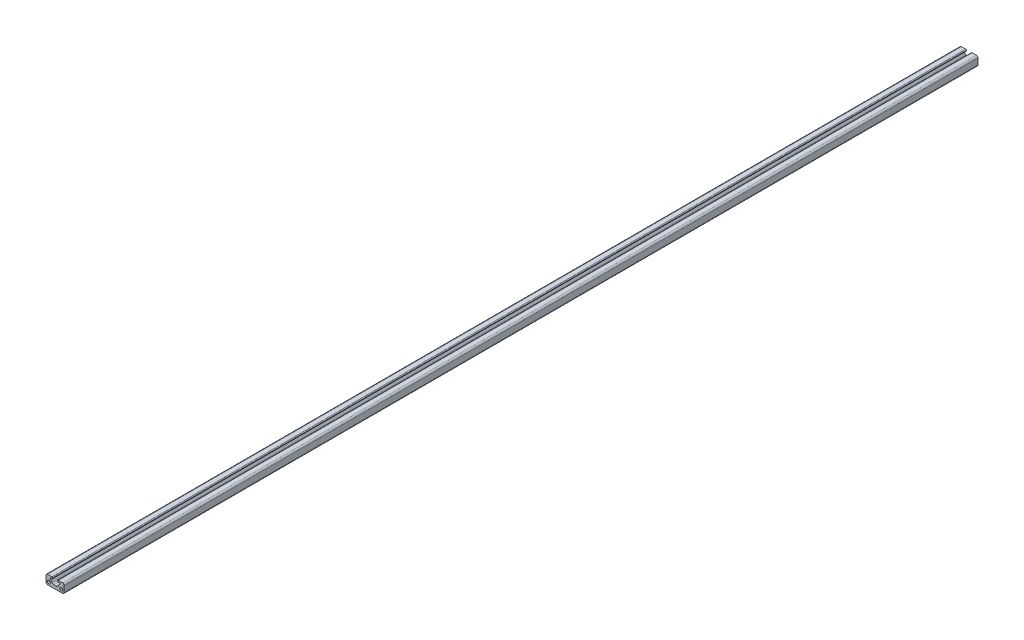
ISO-10303-21;
HEADER;
FILE_DESCRIPTION(('STEP AP214'),'2;1');
FILE_NAME('part.step','',(''),(''),'','','');
FILE_SCHEMA(('AUTOMOTIVE_DESIGN { 1 0 10303 214 1 1 1 1 }'));
ENDSEC;
DATA;
#1=APPLICATION_CONTEXT('core data for automotive mechanical design processes');
#2=APPLICATION_PROTOCOL_DEFINITION('international standard','automotive_design',2000,#1);
#3=PRODUCT_CONTEXT('',#1,'mechanical');
#4=PRODUCT('Part','Part','',(#3));
#5=PRODUCT_RELATED_PRODUCT_CATEGORY('part','',(#4));
#6=PRODUCT_DEFINITION_FORMATION('','',#4);
#7=PRODUCT_DEFINITION_CONTEXT('part definition',#1,'design');
#8=PRODUCT_DEFINITION('design','',#6,#7);
#9=PRODUCT_DEFINITION_SHAPE('','',#8);
#10=(LENGTH_UNIT() NAMED_UNIT(*) SI_UNIT(.MILLI.,.METRE.));
#11=(NAMED_UNIT(*) PLANE_ANGLE_UNIT() SI_UNIT($,.RADIAN.));
#12=(NAMED_UNIT(*) SI_UNIT($,.STERADIAN.) SOLID_ANGLE_UNIT());
#13=UNCERTAINTY_MEASURE_WITH_UNIT(LENGTH_MEASURE(1.E-05),#10,'distance_accuracy_value','');
#14=(GEOMETRIC_REPRESENTATION_CONTEXT(3) GLOBAL_UNCERTAINTY_ASSIGNED_CONTEXT((#13)) GLOBAL_UNIT_ASSIGNED_CONTEXT((#10,
#11,#12)) REPRESENTATION_CONTEXT('',''));
#15=CARTESIAN_POINT('',(0.,0.,0.));
#16=DIRECTION('',(0.,0.,1.));
#17=DIRECTION('',(1.,0.,0.));
#18=AXIS2_PLACEMENT_3D('',#15,#16,#17);
#19=CARTESIAN_POINT('',(0.,-1.87,1257.3));
#20=DIRECTION('',(0.,-1.,0.));
#21=DIRECTION('',(1.,0.,0.));
#22=AXIS2_PLACEMENT_3D('',#19,#20,#21);
#23=PLANE('',#22);
#24=DIRECTION('',(-1.,0.,0.));
#25=VECTOR('',#24,1.);
#26=CARTESIAN_POINT('',(0.,-1.87,1257.3));
#27=LINE('',#26,#25);
#28=CARTESIAN_POINT('',(1.68956591371128,-1.87,1257.3));
#29=VERTEX_POINT('',#28);
#30=CARTESIAN_POINT('',(-1.68956591371128,-1.87,1257.3));
#31=VERTEX_POINT('',#30);
#32=EDGE_CURVE('E334',#29,#31,#27,.T.);
#33=ORIENTED_EDGE('',*,*,#32,.F.);
#34=DIRECTION('',(0.,0.,-1.));
#35=VECTOR('',#34,1.);
#36=CARTESIAN_POINT('',(1.68956591371128,-1.87,4.44089209850063E-13));
#37=LINE('',#36,#35);
#38=CARTESIAN_POINT('',(1.68956591371128,-1.87,0.));
#39=VERTEX_POINT('',#38);
#40=EDGE_CURVE('E327',#29,#39,#37,.T.);
#41=ORIENTED_EDGE('',*,*,#40,.T.);
#42=DIRECTION('',(-1.,0.,0.));
#43=VECTOR('',#42,1.);
#44=CARTESIAN_POINT('',(0.,-1.87,0.));
#45=LINE('',#44,#43);
#46=CARTESIAN_POINT('',(-1.68956591371128,-1.87,0.));
#47=VERTEX_POINT('',#46);
#48=EDGE_CURVE('E333',#39,#47,#45,.T.);
#49=ORIENTED_EDGE('',*,*,#48,.T.);
#50=DIRECTION('',(0.,0.,-1.));
#51=VECTOR('',#50,1.);
#52=CARTESIAN_POINT('',(-1.68956591371128,-1.87,1257.3));
#53=LINE('',#52,#51);
#54=EDGE_CURVE('E319',#47,#31,#53,.F.);
#55=ORIENTED_EDGE('',*,*,#54,.T.);
#56=EDGE_LOOP('',(#33,#41,#49,#55));
#57=FACE_BOUND('',#56,.T.);
#58=ADVANCED_FACE('F36',(#57),#23,.F.);
#59=CARTESIAN_POINT('',(-3.05778914340892,-2.14411755860608,1257.3));
#60=DIRECTION('',(-0.818770593875491,-0.574120818821941,0.));
#61=DIRECTION('',(0.574120818821941,-0.818770593875491,0.));
#62=AXIS2_PLACEMENT_3D('',#59,#60,#61);
#63=PLANE('',#62);
#64=DIRECTION('',(-0.574120818821941,0.818770593875491,0.));
#65=VECTOR('',#64,1.);
#66=CARTESIAN_POINT('',(-3.05778914340892,-2.14411755860608,1257.3));
#67=LINE('',#66,#65);
#68=CARTESIAN_POINT('',(-4.14587769533775,-0.59236245646582,1257.3));
#69=VERTEX_POINT('',#68);
#70=CARTESIAN_POINT('',(-6.75724174982656,3.13178066397732,1257.3));
#71=VERTEX_POINT('',#70);
#72=EDGE_CURVE('E459',#69,#71,#67,.T.);
#73=ORIENTED_EDGE('',*,*,#72,.F.);
#74=DIRECTION('',(0.,0.,-1.));
#75=VECTOR('',#74,1.);
#76=CARTESIAN_POINT('',(-4.14587769533775,-0.59236245646582,4.44089209850063E-13));
#77=LINE('',#76,#75);
#78=CARTESIAN_POINT('',(-4.14587769533775,-0.59236245646582,0.));
#79=VERTEX_POINT('',#78);
#80=EDGE_CURVE('E316',#69,#79,#77,.T.);
#81=ORIENTED_EDGE('',*,*,#80,.T.);
#82=DIRECTION('',(-0.574120818821941,0.818770593875491,0.));
#83=VECTOR('',#82,1.);
#84=CARTESIAN_POINT('',(-3.05778914340892,-2.14411755860608,0.));
#85=LINE('',#84,#83);
#86=CARTESIAN_POINT('',(-6.75724174982656,3.13178066397732,0.));
#87=VERTEX_POINT('',#86);
#88=EDGE_CURVE('E339',#79,#87,#85,.T.);
#89=ORIENTED_EDGE('',*,*,#88,.T.);
#90=DIRECTION('',(0.,0.,-1.));
#91=VECTOR('',#90,1.);
#92=CARTESIAN_POINT('',(-6.75724174982656,3.13178066397732,1257.3));
#93=LINE('',#92,#91);
#94=EDGE_CURVE('E308',#87,#71,#93,.F.);
#95=ORIENTED_EDGE('',*,*,#94,.T.);
#96=EDGE_LOOP('',(#73,#81,#89,#95));
#97=FACE_BOUND('',#96,.T.);
#98=ADVANCED_FACE('F414',(#97),#63,.F.);
#99=CARTESIAN_POINT('',(0.,3.97,1257.3));
#100=DIRECTION('',(0.,-1.,0.));
#101=DIRECTION('',(1.,0.,0.));
#102=AXIS2_PLACEMENT_3D('',#99,#100,#101);
#103=PLANE('',#102);
#104=DIRECTION('',(-1.,0.,0.));
#105=VECTOR('',#104,1.);
#106=CARTESIAN_POINT('',(0.,3.97,1257.3));
#107=LINE('',#106,#105);
#108=CARTESIAN_POINT('',(-4.315,3.97,1257.3));
#109=VERTEX_POINT('',#108);
#110=CARTESIAN_POINT('',(-6.32124640858786,3.97,1257.3));
#111=VERTEX_POINT('',#110);
#112=EDGE_CURVE('E386',#109,#111,#107,.T.);
#113=ORIENTED_EDGE('',*,*,#112,.T.);
#114=DIRECTION('',(0.,0.,-1.));
#115=VECTOR('',#114,1.);
#116=CARTESIAN_POINT('',(-6.32124640858786,3.97,1257.3));
#117=LINE('',#116,#115);
#118=CARTESIAN_POINT('',(-6.32124640858786,3.97,0.));
#119=VERTEX_POINT('',#118);
#120=EDGE_CURVE('E305',#111,#119,#117,.T.);
#121=ORIENTED_EDGE('',*,*,#120,.T.);
#122=DIRECTION('',(-1.,0.,0.));
#123=VECTOR('',#122,1.);
#124=CARTESIAN_POINT('',(0.,3.97,0.));
#125=LINE('',#124,#123);
#126=CARTESIAN_POINT('',(-4.315,3.97,0.));
#127=VERTEX_POINT('',#126);
#128=EDGE_CURVE('E218',#127,#119,#125,.T.);
#129=ORIENTED_EDGE('',*,*,#128,.F.);
#130=DIRECTION('',(0.,0.,-1.));
#131=VECTOR('',#130,1.);
#132=CARTESIAN_POINT('',(-4.315,3.97,1257.3));
#133=LINE('',#132,#131);
#134=EDGE_CURVE('E237',#127,#109,#133,.F.);
#135=ORIENTED_EDGE('',*,*,#134,.T.);
#136=EDGE_LOOP('',(#113,#121,#129,#135));
#137=FACE_BOUND('',#136,.T.);
#138=ADVANCED_FACE('F419',(#137),#103,.T.);
#139=CARTESIAN_POINT('',(-3.25,0.,1257.3));
#140=DIRECTION('',(1.,0.,0.));
#141=DIRECTION('',(0.,1.,0.));
#142=AXIS2_PLACEMENT_3D('',#139,#140,#141);
#143=PLANE('',#142);
#144=DIRECTION('',(0.,-1.,0.));
#145=VECTOR('',#144,1.);
#146=CARTESIAN_POINT('',(-3.25,0.,1257.3));
#147=LINE('',#146,#145);
#148=CARTESIAN_POINT('',(-3.25,5.185,1257.3));
#149=VERTEX_POINT('',#148);
#150=CARTESIAN_POINT('',(-3.25,5.035,1257.3));
#151=VERTEX_POINT('',#150);
#152=EDGE_CURVE('E465',#149,#151,#147,.T.);
#153=ORIENTED_EDGE('',*,*,#152,.T.);
#154=DIRECTION('',(0.,0.,-1.));
#155=VECTOR('',#154,1.);
#156=CARTESIAN_POINT('',(-3.25,5.035,1257.3));
#157=LINE('',#156,#155);
#158=CARTESIAN_POINT('',(-3.25,5.035,0.));
#159=VERTEX_POINT('',#158);
#160=EDGE_CURVE('E217',#151,#159,#157,.T.);
#161=ORIENTED_EDGE('',*,*,#160,.T.);
#162=DIRECTION('',(0.,-1.,0.));
#163=VECTOR('',#162,1.);
#164=CARTESIAN_POINT('',(-3.25,0.,0.));
#165=LINE('',#164,#163);
#166=CARTESIAN_POINT('',(-3.25,5.185,0.));
#167=VERTEX_POINT('',#166);
#168=EDGE_CURVE('E200',#167,#159,#165,.T.);
#169=ORIENTED_EDGE('',*,*,#168,.F.);
#170=DIRECTION('',(0.,0.,-1.));
#171=VECTOR('',#170,1.);
#172=CARTESIAN_POINT('',(-3.25,5.185,1257.3));
#173=LINE('',#172,#171);
#174=EDGE_CURVE('E214',#167,#149,#173,.F.);
#175=ORIENTED_EDGE('',*,*,#174,.T.);
#176=EDGE_LOOP('',(#153,#161,#169,#175));
#177=FACE_BOUND('',#176,.T.);
#178=ADVANCED_FACE('F213',(#177),#143,.T.);
#179=CARTESIAN_POINT('',(0.,6.25,1257.3));
#180=DIRECTION('',(0.,-1.,0.));
#181=DIRECTION('',(1.,0.,0.));
#182=AXIS2_PLACEMENT_3D('',#179,#180,#181);
#183=PLANE('',#182);
#184=DIRECTION('',(-1.,0.,0.));
#185=VECTOR('',#184,1.);
#186=CARTESIAN_POINT('',(0.,6.25,0.));
#187=LINE('',#186,#185);
#188=CARTESIAN_POINT('',(-4.315,6.25,0.));
#189=VERTEX_POINT('',#188);
#190=CARTESIAN_POINT('',(-10.37,6.25,0.));
#191=VERTEX_POINT('',#190);
#192=EDGE_CURVE('E202',#189,#191,#187,.T.);
#193=ORIENTED_EDGE('',*,*,#192,.T.);
#194=DIRECTION('',(0.,0.,-1.));
#195=VECTOR('',#194,1.);
#196=CARTESIAN_POINT('',(-10.37,6.25,1257.3));
#197=LINE('',#196,#195);
#198=CARTESIAN_POINT('',(-10.37,6.25,1257.3));
#199=VERTEX_POINT('',#198);
#200=EDGE_CURVE('E294',#191,#199,#197,.F.);
#201=ORIENTED_EDGE('',*,*,#200,.T.);
#202=DIRECTION('',(-1.,0.,0.));
#203=VECTOR('',#202,1.);
#204=CARTESIAN_POINT('',(0.,6.25,1257.3));
#205=LINE('',#204,#203);
#206=CARTESIAN_POINT('',(-4.315,6.25,1257.3));
#207=VERTEX_POINT('',#206);
#208=EDGE_CURVE('E389',#207,#199,#205,.T.);
#209=ORIENTED_EDGE('',*,*,#208,.F.);
#210=DIRECTION('',(0.,0.,-1.));
#211=VECTOR('',#210,1.);
#212=CARTESIAN_POINT('',(-4.315,6.25,0.));
#213=LINE('',#212,#211);
#214=EDGE_CURVE('E247',#207,#189,#213,.T.);
#215=ORIENTED_EDGE('',*,*,#214,.T.);
#216=EDGE_LOOP('',(#193,#201,#209,#215));
#217=FACE_BOUND('',#216,.T.);
#218=ADVANCED_FACE('F425',(#217),#183,.F.);
#219=CARTESIAN_POINT('',(-12.5,0.,1257.3));
#220=DIRECTION('',(1.,0.,0.));
#221=DIRECTION('',(0.,1.,0.));
#222=AXIS2_PLACEMENT_3D('',#219,#220,#221);
#223=PLANE('',#222);
#224=DIRECTION('',(0.,-1.,0.));
#225=VECTOR('',#224,1.);
#226=CARTESIAN_POINT('',(-12.5,0.,0.));
#227=LINE('',#226,#225);
#228=CARTESIAN_POINT('',(-12.5,4.12,0.));
#229=VERTEX_POINT('',#228);
#230=CARTESIAN_POINT('',(-12.5,-4.12,0.));
#231=VERTEX_POINT('',#230);
#232=EDGE_CURVE('E352',#229,#231,#227,.T.);
#233=ORIENTED_EDGE('',*,*,#232,.T.);
#234=DIRECTION('',(0.,0.,-1.));
#235=VECTOR('',#234,1.);
#236=CARTESIAN_POINT('',(-12.5,-4.12,1257.3));
#237=LINE('',#236,#235);
#238=CARTESIAN_POINT('',(-12.5,-4.12,1257.3));
#239=VERTEX_POINT('',#238);
#240=EDGE_CURVE('E292',#231,#239,#237,.F.);
#241=ORIENTED_EDGE('',*,*,#240,.T.);
#242=DIRECTION('',(0.,-1.,0.));
#243=VECTOR('',#242,1.);
#244=CARTESIAN_POINT('',(-12.5,0.,1257.3));
#245=LINE('',#244,#243);
#246=CARTESIAN_POINT('',(-12.5,4.12,1257.3));
#247=VERTEX_POINT('',#246);
#248=EDGE_CURVE('E468',#247,#239,#245,.T.);
#249=ORIENTED_EDGE('',*,*,#248,.F.);
#250=DIRECTION('',(0.,0.,-1.));
#251=VECTOR('',#250,1.);
#252=CARTESIAN_POINT('',(-12.5,4.12,1257.3));
#253=LINE('',#252,#251);
#254=EDGE_CURVE('E289',#247,#229,#253,.T.);
#255=ORIENTED_EDGE('',*,*,#254,.T.);
#256=EDGE_LOOP('',(#233,#241,#249,#255));
#257=FACE_BOUND('',#256,.T.);
#258=ADVANCED_FACE('F426',(#257),#223,.F.);
#259=CARTESIAN_POINT('',(0.,-6.25,1257.3));
#260=DIRECTION('',(0.,-1.,0.));
#261=DIRECTION('',(1.,0.,0.));
#262=AXIS2_PLACEMENT_3D('',#259,#260,#261);
#263=PLANE('',#262);
#264=DIRECTION('',(-1.,0.,0.));
#265=VECTOR('',#264,1.);
#266=CARTESIAN_POINT('',(0.,-6.25,0.));
#267=LINE('',#266,#265);
#268=CARTESIAN_POINT('',(10.37,-6.25,0.));
#269=VERTEX_POINT('',#268);
#270=CARTESIAN_POINT('',(-10.37,-6.25,0.));
#271=VERTEX_POINT('',#270);
#272=EDGE_CURVE('E356',#269,#271,#267,.T.);
#273=ORIENTED_EDGE('',*,*,#272,.F.);
#274=DIRECTION('',(0.,0.,-1.));
#275=VECTOR('',#274,1.);
#276=CARTESIAN_POINT('',(10.37,-6.25,1257.3));
#277=LINE('',#276,#275);
#278=CARTESIAN_POINT('',(10.37,-6.25,1257.3));
#279=VERTEX_POINT('',#278);
#280=EDGE_CURVE('E281',#269,#279,#277,.F.);
#281=ORIENTED_EDGE('',*,*,#280,.T.);
#282=DIRECTION('',(-1.,0.,0.));
#283=VECTOR('',#282,1.);
#284=CARTESIAN_POINT('',(0.,-6.25,1257.3));
#285=LINE('',#284,#283);
#286=CARTESIAN_POINT('',(-10.37,-6.25,1257.3));
#287=VERTEX_POINT('',#286);
#288=EDGE_CURVE('E470',#279,#287,#285,.T.);
#289=ORIENTED_EDGE('',*,*,#288,.T.);
#290=DIRECTION('',(0.,0.,-1.));
#291=VECTOR('',#290,1.);
#292=CARTESIAN_POINT('',(-10.37,-6.25,0.));
#293=LINE('',#292,#291);
#294=EDGE_CURVE('E278',#287,#271,#293,.T.);
#295=ORIENTED_EDGE('',*,*,#294,.T.);
#296=EDGE_LOOP('',(#273,#281,#289,#295));
#297=FACE_BOUND('',#296,.T.);
#298=ADVANCED_FACE('F429',(#297),#263,.T.);
#299=CARTESIAN_POINT('',(12.5,0.,1257.3));
#300=DIRECTION('',(1.,0.,0.));
#301=DIRECTION('',(0.,1.,0.));
#302=AXIS2_PLACEMENT_3D('',#299,#300,#301);
#303=PLANE('',#302);
#304=DIRECTION('',(0.,-1.,0.));
#305=VECTOR('',#304,1.);
#306=CARTESIAN_POINT('',(12.5,0.,1257.3));
#307=LINE('',#306,#305);
#308=CARTESIAN_POINT('',(12.5,4.12,1257.3));
#309=VERTEX_POINT('',#308);
#310=CARTESIAN_POINT('',(12.5,-4.12,1257.3));
#311=VERTEX_POINT('',#310);
#312=EDGE_CURVE('E387',#309,#311,#307,.T.);
#313=ORIENTED_EDGE('',*,*,#312,.T.);
#314=DIRECTION('',(0.,0.,-1.));
#315=VECTOR('',#314,1.);
#316=CARTESIAN_POINT('',(12.5,-4.12,1257.3));
#317=LINE('',#316,#315);
#318=CARTESIAN_POINT('',(12.5,-4.12,0.));
#319=VERTEX_POINT('',#318);
#320=EDGE_CURVE('E269',#311,#319,#317,.T.);
#321=ORIENTED_EDGE('',*,*,#320,.T.);
#322=DIRECTION('',(0.,-1.,0.));
#323=VECTOR('',#322,1.);
#324=CARTESIAN_POINT('',(12.5,0.,0.));
#325=LINE('',#324,#323);
#326=CARTESIAN_POINT('',(12.5,4.12,0.));
#327=VERTEX_POINT('',#326);
#328=EDGE_CURVE('E359',#327,#319,#325,.T.);
#329=ORIENTED_EDGE('',*,*,#328,.F.);
#330=DIRECTION('',(0.,0.,-1.));
#331=VECTOR('',#330,1.);
#332=CARTESIAN_POINT('',(12.5,4.12,1257.3));
#333=LINE('',#332,#331);
#334=EDGE_CURVE('E265',#327,#309,#333,.F.);
#335=ORIENTED_EDGE('',*,*,#334,.T.);
#336=EDGE_LOOP('',(#313,#321,#329,#335));
#337=FACE_BOUND('',#336,.T.);
#338=ADVANCED_FACE('F433',(#337),#303,.T.);
#339=CARTESIAN_POINT('',(10.37,6.25,1257.3));
#340=VERTEX_POINT('',#339);
#341=CARTESIAN_POINT('',(4.315,6.25,1257.3));
#342=VERTEX_POINT('',#341);
#343=EDGE_CURVE('E382',#340,#342,#205,.T.);
#344=ORIENTED_EDGE('',*,*,#343,.F.);
#345=DIRECTION('',(0.,0.,-1.));
#346=VECTOR('',#345,1.);
#347=CARTESIAN_POINT('',(10.37,6.25,0.));
#348=LINE('',#347,#346);
#349=CARTESIAN_POINT('',(10.37,6.25,0.));
#350=VERTEX_POINT('',#349);
#351=EDGE_CURVE('E260',#340,#350,#348,.T.);
#352=ORIENTED_EDGE('',*,*,#351,.T.);
#353=CARTESIAN_POINT('',(4.315,6.25,0.));
#354=VERTEX_POINT('',#353);
#355=EDGE_CURVE('E353',#350,#354,#187,.T.);
#356=ORIENTED_EDGE('',*,*,#355,.T.);
#357=DIRECTION('',(0.,0.,-1.));
#358=VECTOR('',#357,1.);
#359=CARTESIAN_POINT('',(4.315,6.25,1257.3));
#360=LINE('',#359,#358);
#361=EDGE_CURVE('E257',#354,#342,#360,.F.);
#362=ORIENTED_EDGE('',*,*,#361,.T.);
#363=EDGE_LOOP('',(#344,#352,#356,#362));
#364=FACE_BOUND('',#363,.T.);
#365=ADVANCED_FACE('F368',(#364),#183,.F.);
#366=CARTESIAN_POINT('',(3.25,0.,1257.3));
#367=DIRECTION('',(1.,0.,0.));
#368=DIRECTION('',(0.,1.,0.));
#369=AXIS2_PLACEMENT_3D('',#366,#367,#368);
#370=PLANE('',#369);
#371=DIRECTION('',(0.,-1.,0.));
#372=VECTOR('',#371,1.);
#373=CARTESIAN_POINT('',(3.25,0.,0.));
#374=LINE('',#373,#372);
#375=CARTESIAN_POINT('',(3.25,5.185,0.));
#376=VERTEX_POINT('',#375);
#377=CARTESIAN_POINT('',(3.25,5.035,0.));
#378=VERTEX_POINT('',#377);
#379=EDGE_CURVE('E360',#376,#378,#374,.T.);
#380=ORIENTED_EDGE('',*,*,#379,.T.);
#381=DIRECTION('',(0.,0.,-1.));
#382=VECTOR('',#381,1.);
#383=CARTESIAN_POINT('',(3.25,5.035,1257.3));
#384=LINE('',#383,#382);
#385=CARTESIAN_POINT('',(3.25,5.035,1257.3));
#386=VERTEX_POINT('',#385);
#387=EDGE_CURVE('E255',#378,#386,#384,.F.);
#388=ORIENTED_EDGE('',*,*,#387,.T.);
#389=DIRECTION('',(0.,-1.,0.));
#390=VECTOR('',#389,1.);
#391=CARTESIAN_POINT('',(3.25,0.,1257.3));
#392=LINE('',#391,#390);
#393=CARTESIAN_POINT('',(3.25,5.185,1257.3));
#394=VERTEX_POINT('',#393);
#395=EDGE_CURVE('E380',#394,#386,#392,.T.);
#396=ORIENTED_EDGE('',*,*,#395,.F.);
#397=DIRECTION('',(0.,0.,-1.));
#398=VECTOR('',#397,1.);
#399=CARTESIAN_POINT('',(3.25,5.185,1257.3));
#400=LINE('',#399,#398);
#401=EDGE_CURVE('E252',#394,#376,#400,.T.);
#402=ORIENTED_EDGE('',*,*,#401,.T.);
#403=EDGE_LOOP('',(#380,#388,#396,#402));
#404=FACE_BOUND('',#403,.T.);
#405=ADVANCED_FACE('F383',(#404),#370,.F.);
#406=CARTESIAN_POINT('',(6.32124640858786,3.97,0.));
#407=VERTEX_POINT('',#406);
#408=CARTESIAN_POINT('',(4.315,3.97,0.));
#409=VERTEX_POINT('',#408);
#410=EDGE_CURVE('E349',#407,#409,#125,.T.);
#411=ORIENTED_EDGE('',*,*,#410,.F.);
#412=DIRECTION('',(0.,0.,-1.));
#413=VECTOR('',#412,1.);
#414=CARTESIAN_POINT('',(6.32124640858786,3.97,1257.3));
#415=LINE('',#414,#413);
#416=CARTESIAN_POINT('',(6.32124640858786,3.97,1257.3));
#417=VERTEX_POINT('',#416);
#418=EDGE_CURVE('E299',#407,#417,#415,.F.);
#419=ORIENTED_EDGE('',*,*,#418,.T.);
#420=CARTESIAN_POINT('',(4.315,3.97,1257.3));
#421=VERTEX_POINT('',#420);
#422=EDGE_CURVE('E227',#417,#421,#107,.T.);
#423=ORIENTED_EDGE('',*,*,#422,.T.);
#424=DIRECTION('',(0.,0.,-1.));
#425=VECTOR('',#424,1.);
#426=CARTESIAN_POINT('',(4.315,3.97,0.));
#427=LINE('',#426,#425);
#428=EDGE_CURVE('E249',#421,#409,#427,.T.);
#429=ORIENTED_EDGE('',*,*,#428,.T.);
#430=EDGE_LOOP('',(#411,#419,#423,#429));
#431=FACE_BOUND('',#430,.T.);
#432=ADVANCED_FACE('F408',(#431),#103,.T.);
#433=CARTESIAN_POINT('',(-8.5,-2.25,1257.3));
#434=DIRECTION('',(0.,0.,-1.));
#435=DIRECTION('',(-1.,0.,0.));
#436=AXIS2_PLACEMENT_3D('',#433,#434,#435);
#437=CYLINDRICAL_SURFACE('',#436,2.);
#438=CARTESIAN_POINT('',(-8.5,-2.25,1257.3));
#439=DIRECTION('',(0.,0.,1.));
#440=DIRECTION('',(1.,0.,0.));
#441=AXIS2_PLACEMENT_3D('',#438,#439,#440);
#442=CIRCLE('',#441,2.);
#443=CARTESIAN_POINT('',(-6.5,-2.25,1257.3));
#444=VERTEX_POINT('',#443);
#445=EDGE_CURVE('E457',#444,#444,#442,.T.);
#446=ORIENTED_EDGE('',*,*,#445,.T.);
#447=EDGE_LOOP('',(#446));
#448=FACE_BOUND('',#447,.T.);
#449=CARTESIAN_POINT('',(-8.5,-2.25,0.));
#450=DIRECTION('',(0.,0.,1.));
#451=DIRECTION('',(1.,0.,0.));
#452=AXIS2_PLACEMENT_3D('',#449,#450,#451);
#453=CIRCLE('',#452,2.);
#454=CARTESIAN_POINT('',(-6.5,-2.25,0.));
#455=VERTEX_POINT('',#454);
#456=EDGE_CURVE('E340',#455,#455,#453,.T.);
#457=ORIENTED_EDGE('',*,*,#456,.F.);
#458=EDGE_LOOP('',(#457));
#459=FACE_BOUND('',#458,.T.);
#460=ADVANCED_FACE('F400',(#448,#459),#437,.F.);
#461=CARTESIAN_POINT('',(8.5,-2.25,1257.3));
#462=DIRECTION('',(0.,0.,-1.));
#463=DIRECTION('',(-1.,0.,0.));
#464=AXIS2_PLACEMENT_3D('',#461,#462,#463);
#465=CYLINDRICAL_SURFACE('',#464,2.);
#466=CARTESIAN_POINT('',(8.5,-2.25,1257.3));
#467=DIRECTION('',(0.,0.,1.));
#468=DIRECTION('',(1.,0.,0.));
#469=AXIS2_PLACEMENT_3D('',#466,#467,#468);
#470=CIRCLE('',#469,2.);
#471=CARTESIAN_POINT('',(10.5,-2.25,1257.3));
#472=VERTEX_POINT('',#471);
#473=EDGE_CURVE('E454',#472,#472,#470,.T.);
#474=ORIENTED_EDGE('',*,*,#473,.T.);
#475=EDGE_LOOP('',(#474));
#476=FACE_BOUND('',#475,.T.);
#477=CARTESIAN_POINT('',(8.5,-2.25,0.));
#478=DIRECTION('',(0.,0.,1.));
#479=DIRECTION('',(1.,0.,0.));
#480=AXIS2_PLACEMENT_3D('',#477,#478,#479);
#481=CIRCLE('',#480,2.);
#482=CARTESIAN_POINT('',(10.5,-2.25,0.));
#483=VERTEX_POINT('',#482);
#484=EDGE_CURVE('E344',#483,#483,#481,.T.);
#485=ORIENTED_EDGE('',*,*,#484,.F.);
#486=EDGE_LOOP('',(#485));
#487=FACE_BOUND('',#486,.T.);
#488=ADVANCED_FACE('F397',(#476,#487),#465,.F.);
#489=CARTESIAN_POINT('',(3.05778914340892,-2.14411755860608,1257.3));
#490=DIRECTION('',(0.818770593875491,-0.574120818821941,0.));
#491=DIRECTION('',(0.574120818821941,0.818770593875491,0.));
#492=AXIS2_PLACEMENT_3D('',#489,#490,#491);
#493=PLANE('',#492);
#494=DIRECTION('',(-0.574120818821941,-0.818770593875491,0.));
#495=VECTOR('',#494,1.);
#496=CARTESIAN_POINT('',(3.05778914340892,-2.14411755860608,0.));
#497=LINE('',#496,#495);
#498=CARTESIAN_POINT('',(6.75724174982656,3.13178066397732,0.));
#499=VERTEX_POINT('',#498);
#500=CARTESIAN_POINT('',(4.14587769533775,-0.592362456465818,0.));
#501=VERTEX_POINT('',#500);
#502=EDGE_CURVE('E230',#499,#501,#497,.T.);
#503=ORIENTED_EDGE('',*,*,#502,.T.);
#504=DIRECTION('',(0.,0.,-1.));
#505=VECTOR('',#504,1.);
#506=CARTESIAN_POINT('',(4.14587769533775,-0.592362456465819,1257.3));
#507=LINE('',#506,#505);
#508=CARTESIAN_POINT('',(4.14587769533775,-0.592362456465818,1257.3));
#509=VERTEX_POINT('',#508);
#510=EDGE_CURVE('E57',#501,#509,#507,.F.);
#511=ORIENTED_EDGE('',*,*,#510,.T.);
#512=DIRECTION('',(-0.574120818821941,-0.818770593875491,0.));
#513=VECTOR('',#512,1.);
#514=CARTESIAN_POINT('',(3.05778914340892,-2.14411755860608,1257.3));
#515=LINE('',#514,#513);
#516=CARTESIAN_POINT('',(6.75724174982656,3.13178066397732,1257.3));
#517=VERTEX_POINT('',#516);
#518=EDGE_CURVE('E223',#517,#509,#515,.T.);
#519=ORIENTED_EDGE('',*,*,#518,.F.);
#520=DIRECTION('',(0.,0.,-1.));
#521=VECTOR('',#520,1.);
#522=CARTESIAN_POINT('',(6.75724174982656,3.13178066397732,1257.3));
#523=LINE('',#522,#521);
#524=EDGE_CURVE('E296',#517,#499,#523,.T.);
#525=ORIENTED_EDGE('',*,*,#524,.T.);
#526=EDGE_LOOP('',(#503,#511,#519,#525));
#527=FACE_BOUND('',#526,.T.);
#528=ADVANCED_FACE('F399',(#527),#493,.F.);
#529=CARTESIAN_POINT('',(0.,0.,1257.3));
#530=DIRECTION('',(0.,0.,1.));
#531=DIRECTION('',(1.,0.,0.));
#532=AXIS2_PLACEMENT_3D('',#529,#530,#531);
#533=PLANE('',#532);
#534=ORIENTED_EDGE('',*,*,#473,.F.);
#535=EDGE_LOOP('',(#534));
#536=FACE_BOUND('',#535,.T.);
#537=ORIENTED_EDGE('',*,*,#445,.F.);
#538=EDGE_LOOP('',(#537));
#539=FACE_BOUND('',#538,.T.);
#540=ORIENTED_EDGE('',*,*,#288,.F.);
#541=CARTESIAN_POINT('',(10.37,-4.12,1257.3));
#542=DIRECTION('',(0.,0.,1.));
#543=DIRECTION('',(1.,0.,0.));
#544=AXIS2_PLACEMENT_3D('',#541,#542,#543);
#545=CIRCLE('',#544,2.13);
#546=EDGE_CURVE('E287',#279,#311,#545,.T.);
#547=ORIENTED_EDGE('',*,*,#546,.T.);
#548=ORIENTED_EDGE('',*,*,#312,.F.);
#549=CARTESIAN_POINT('',(10.37,4.12,1257.3));
#550=DIRECTION('',(0.,0.,1.));
#551=DIRECTION('',(1.,0.,0.));
#552=AXIS2_PLACEMENT_3D('',#549,#550,#551);
#553=CIRCLE('',#552,2.13);
#554=EDGE_CURVE('E267',#309,#340,#553,.T.);
#555=ORIENTED_EDGE('',*,*,#554,.T.);
#556=ORIENTED_EDGE('',*,*,#343,.T.);
#557=CARTESIAN_POINT('',(4.315,5.185,1257.3));
#558=DIRECTION('',(0.,0.,1.));
#559=DIRECTION('',(1.,0.,0.));
#560=AXIS2_PLACEMENT_3D('',#557,#558,#559);
#561=CIRCLE('',#560,1.065);
#562=EDGE_CURVE('E239',#342,#394,#561,.T.);
#563=ORIENTED_EDGE('',*,*,#562,.T.);
#564=ORIENTED_EDGE('',*,*,#395,.T.);
#565=CARTESIAN_POINT('',(4.315,5.035,1257.3));
#566=DIRECTION('',(0.,0.,1.));
#567=DIRECTION('',(1.,0.,0.));
#568=AXIS2_PLACEMENT_3D('',#565,#566,#567);
#569=CIRCLE('',#568,1.065);
#570=EDGE_CURVE('E241',#386,#421,#569,.T.);
#571=ORIENTED_EDGE('',*,*,#570,.T.);
#572=ORIENTED_EDGE('',*,*,#422,.F.);
#573=CARTESIAN_POINT('',(6.32124640858786,3.4375,1257.3));
#574=DIRECTION('',(0.,0.,1.));
#575=DIRECTION('',(1.,0.,0.));
#576=AXIS2_PLACEMENT_3D('',#573,#574,#575);
#577=CIRCLE('',#576,0.5325);
#578=EDGE_CURVE('E303',#417,#517,#577,.F.);
#579=ORIENTED_EDGE('',*,*,#578,.T.);
#580=ORIENTED_EDGE('',*,*,#518,.T.);
#581=CARTESIAN_POINT('',(1.68956591371127,1.13,1257.3));
#582=DIRECTION('',(0.,0.,1.));
#583=DIRECTION('',(1.,0.,0.));
#584=AXIS2_PLACEMENT_3D('',#581,#582,#583);
#585=CIRCLE('',#584,3.);
#586=EDGE_CURVE('E11',#509,#29,#585,.F.);
#587=ORIENTED_EDGE('',*,*,#586,.T.);
#588=ORIENTED_EDGE('',*,*,#32,.T.);
#589=CARTESIAN_POINT('',(-1.68956591371128,1.13,1257.3));
#590=DIRECTION('',(0.,0.,1.));
#591=DIRECTION('',(1.,0.,0.));
#592=AXIS2_PLACEMENT_3D('',#589,#590,#591);
#593=CIRCLE('',#592,3.);
#594=EDGE_CURVE('E325',#31,#69,#593,.F.);
#595=ORIENTED_EDGE('',*,*,#594,.T.);
#596=ORIENTED_EDGE('',*,*,#72,.T.);
#597=CARTESIAN_POINT('',(-6.32124640858786,3.4375,1257.3));
#598=DIRECTION('',(0.,0.,1.));
#599=DIRECTION('',(1.,0.,0.));
#600=AXIS2_PLACEMENT_3D('',#597,#598,#599);
#601=CIRCLE('',#600,0.5325);
#602=EDGE_CURVE('E314',#71,#111,#601,.F.);
#603=ORIENTED_EDGE('',*,*,#602,.T.);
#604=ORIENTED_EDGE('',*,*,#112,.F.);
#605=CARTESIAN_POINT('',(-4.315,5.035,1257.3));
#606=DIRECTION('',(0.,0.,1.));
#607=DIRECTION('',(1.,0.,0.));
#608=AXIS2_PLACEMENT_3D('',#605,#606,#607);
#609=CIRCLE('',#608,1.065);
#610=EDGE_CURVE('E245',#109,#151,#609,.T.);
#611=ORIENTED_EDGE('',*,*,#610,.T.);
#612=ORIENTED_EDGE('',*,*,#152,.F.);
#613=CARTESIAN_POINT('',(-4.315,5.185,1257.3));
#614=DIRECTION('',(0.,0.,1.));
#615=DIRECTION('',(1.,0.,0.));
#616=AXIS2_PLACEMENT_3D('',#613,#614,#615);
#617=CIRCLE('',#616,1.065);
#618=EDGE_CURVE('E222',#149,#207,#617,.T.);
#619=ORIENTED_EDGE('',*,*,#618,.T.);
#620=ORIENTED_EDGE('',*,*,#208,.T.);
#621=CARTESIAN_POINT('',(-10.37,4.12,1257.3));
#622=DIRECTION('',(0.,0.,1.));
#623=DIRECTION('',(1.,0.,0.));
#624=AXIS2_PLACEMENT_3D('',#621,#622,#623);
#625=CIRCLE('',#624,2.13);
#626=EDGE_CURVE('E283',#199,#247,#625,.T.);
#627=ORIENTED_EDGE('',*,*,#626,.T.);
#628=ORIENTED_EDGE('',*,*,#248,.T.);
#629=CARTESIAN_POINT('',(-10.37,-4.12,1257.3));
#630=DIRECTION('',(0.,0.,1.));
#631=DIRECTION('',(1.,0.,0.));
#632=AXIS2_PLACEMENT_3D('',#629,#630,#631);
#633=CIRCLE('',#632,2.13);
#634=EDGE_CURVE('E285',#239,#287,#633,.T.);
#635=ORIENTED_EDGE('',*,*,#634,.T.);
#636=EDGE_LOOP('',(#540,#547,#548,#555,#556,#563,#564,#571,#572,#579,#580,#587,#588,#595,#596,
#603,#604,#611,#612,#619,#620,#627,#628,#635));
#637=FACE_BOUND('',#636,.T.);
#638=ADVANCED_FACE('F379',(#536,#539,#637),#533,.T.);
#639=CARTESIAN_POINT('',(0.,0.,0.));
#640=DIRECTION('',(0.,0.,1.));
#641=DIRECTION('',(1.,0.,0.));
#642=AXIS2_PLACEMENT_3D('',#639,#640,#641);
#643=PLANE('',#642);
#644=ORIENTED_EDGE('',*,*,#484,.T.);
#645=EDGE_LOOP('',(#644));
#646=FACE_BOUND('',#645,.T.);
#647=ORIENTED_EDGE('',*,*,#456,.T.);
#648=EDGE_LOOP('',(#647));
#649=FACE_BOUND('',#648,.T.);
#650=ORIENTED_EDGE('',*,*,#328,.T.);
#651=CARTESIAN_POINT('',(10.37,-4.12,0.));
#652=DIRECTION('',(0.,0.,1.));
#653=DIRECTION('',(1.,0.,0.));
#654=AXIS2_PLACEMENT_3D('',#651,#652,#653);
#655=CIRCLE('',#654,2.13);
#656=EDGE_CURVE('E276',#319,#269,#655,.F.);
#657=ORIENTED_EDGE('',*,*,#656,.T.);
#658=ORIENTED_EDGE('',*,*,#272,.T.);
#659=CARTESIAN_POINT('',(-10.37,-4.12,0.));
#660=DIRECTION('',(0.,0.,1.));
#661=DIRECTION('',(1.,0.,0.));
#662=AXIS2_PLACEMENT_3D('',#659,#660,#661);
#663=CIRCLE('',#662,2.13);
#664=EDGE_CURVE('E274',#271,#231,#663,.F.);
#665=ORIENTED_EDGE('',*,*,#664,.T.);
#666=ORIENTED_EDGE('',*,*,#232,.F.);
#667=CARTESIAN_POINT('',(-10.37,4.12,0.));
#668=DIRECTION('',(0.,0.,1.));
#669=DIRECTION('',(1.,0.,0.));
#670=AXIS2_PLACEMENT_3D('',#667,#668,#669);
#671=CIRCLE('',#670,2.13);
#672=EDGE_CURVE('E272',#229,#191,#671,.F.);
#673=ORIENTED_EDGE('',*,*,#672,.T.);
#674=ORIENTED_EDGE('',*,*,#192,.F.);
#675=CARTESIAN_POINT('',(-4.315,5.185,0.));
#676=DIRECTION('',(0.,0.,1.));
#677=DIRECTION('',(1.,0.,0.));
#678=AXIS2_PLACEMENT_3D('',#675,#676,#677);
#679=CIRCLE('',#678,1.065);
#680=EDGE_CURVE('E196',#189,#167,#679,.F.);
#681=ORIENTED_EDGE('',*,*,#680,.T.);
#682=ORIENTED_EDGE('',*,*,#168,.T.);
#683=CARTESIAN_POINT('',(-4.315,5.035,0.));
#684=DIRECTION('',(0.,0.,1.));
#685=DIRECTION('',(1.,0.,0.));
#686=AXIS2_PLACEMENT_3D('',#683,#684,#685);
#687=CIRCLE('',#686,1.065);
#688=EDGE_CURVE('E207',#159,#127,#687,.F.);
#689=ORIENTED_EDGE('',*,*,#688,.T.);
#690=ORIENTED_EDGE('',*,*,#128,.T.);
#691=CARTESIAN_POINT('',(-6.32124640858786,3.4375,0.));
#692=DIRECTION('',(0.,0.,1.));
#693=DIRECTION('',(1.,0.,0.));
#694=AXIS2_PLACEMENT_3D('',#691,#692,#693);
#695=CIRCLE('',#694,0.5325);
#696=EDGE_CURVE('E311',#119,#87,#695,.T.);
#697=ORIENTED_EDGE('',*,*,#696,.T.);
#698=ORIENTED_EDGE('',*,*,#88,.F.);
#699=CARTESIAN_POINT('',(-1.68956591371128,1.13,0.));
#700=DIRECTION('',(0.,0.,1.));
#701=DIRECTION('',(1.,0.,0.));
#702=AXIS2_PLACEMENT_3D('',#699,#700,#701);
#703=CIRCLE('',#702,3.);
#704=EDGE_CURVE('E322',#79,#47,#703,.T.);
#705=ORIENTED_EDGE('',*,*,#704,.T.);
#706=ORIENTED_EDGE('',*,*,#48,.F.);
#707=CARTESIAN_POINT('',(1.68956591371127,1.13,0.));
#708=DIRECTION('',(0.,0.,1.));
#709=DIRECTION('',(1.,0.,0.));
#710=AXIS2_PLACEMENT_3D('',#707,#708,#709);
#711=CIRCLE('',#710,3.);
#712=EDGE_CURVE('E44',#39,#501,#711,.T.);
#713=ORIENTED_EDGE('',*,*,#712,.T.);
#714=ORIENTED_EDGE('',*,*,#502,.F.);
#715=CARTESIAN_POINT('',(6.32124640858786,3.4375,0.));
#716=DIRECTION('',(0.,0.,1.));
#717=DIRECTION('',(1.,0.,0.));
#718=AXIS2_PLACEMENT_3D('',#715,#716,#717);
#719=CIRCLE('',#718,0.5325);
#720=EDGE_CURVE('E301',#499,#407,#719,.T.);
#721=ORIENTED_EDGE('',*,*,#720,.T.);
#722=ORIENTED_EDGE('',*,*,#410,.T.);
#723=CARTESIAN_POINT('',(4.315,5.035,0.));
#724=DIRECTION('',(0.,0.,1.));
#725=DIRECTION('',(1.,0.,0.));
#726=AXIS2_PLACEMENT_3D('',#723,#724,#725);
#727=CIRCLE('',#726,1.065);
#728=EDGE_CURVE('E208',#409,#378,#727,.F.);
#729=ORIENTED_EDGE('',*,*,#728,.T.);
#730=ORIENTED_EDGE('',*,*,#379,.F.);
#731=CARTESIAN_POINT('',(4.315,5.185,0.));
#732=DIRECTION('',(0.,0.,1.));
#733=DIRECTION('',(1.,0.,0.));
#734=AXIS2_PLACEMENT_3D('',#731,#732,#733);
#735=CIRCLE('',#734,1.065);
#736=EDGE_CURVE('E225',#376,#354,#735,.F.);
#737=ORIENTED_EDGE('',*,*,#736,.T.);
#738=ORIENTED_EDGE('',*,*,#355,.F.);
#739=CARTESIAN_POINT('',(10.37,4.12,0.));
#740=DIRECTION('',(0.,0.,1.));
#741=DIRECTION('',(1.,0.,0.));
#742=AXIS2_PLACEMENT_3D('',#739,#740,#741);
#743=CIRCLE('',#742,2.13);
#744=EDGE_CURVE('E263',#350,#327,#743,.F.);
#745=ORIENTED_EDGE('',*,*,#744,.T.);
#746=EDGE_LOOP('',(#650,#657,#658,#665,#666,#673,#674,#681,#682,#689,#690,#697,#698,#705,#706,
#713,#714,#721,#722,#729,#730,#737,#738,#745));
#747=FACE_BOUND('',#746,.T.);
#748=ADVANCED_FACE('F199',(#646,#649,#747),#643,.F.);
#749=CARTESIAN_POINT('',(-4.315,5.035,1257.3));
#750=DIRECTION('',(0.,0.,-1.));
#751=DIRECTION('',(-1.,0.,0.));
#752=AXIS2_PLACEMENT_3D('',#749,#750,#751);
#753=CYLINDRICAL_SURFACE('',#752,1.065);
#754=ORIENTED_EDGE('',*,*,#610,.F.);
#755=ORIENTED_EDGE('',*,*,#134,.F.);
#756=ORIENTED_EDGE('',*,*,#688,.F.);
#757=ORIENTED_EDGE('',*,*,#160,.F.);
#758=EDGE_LOOP('',(#754,#755,#756,#757));
#759=FACE_BOUND('',#758,.T.);
#760=ADVANCED_FACE('F447',(#759),#753,.T.);
#761=CARTESIAN_POINT('',(-4.315,5.185,1257.3));
#762=DIRECTION('',(0.,0.,1.));
#763=DIRECTION('',(1.,0.,0.));
#764=AXIS2_PLACEMENT_3D('',#761,#762,#763);
#765=CYLINDRICAL_SURFACE('',#764,1.065);
#766=ORIENTED_EDGE('',*,*,#618,.F.);
#767=ORIENTED_EDGE('',*,*,#174,.F.);
#768=ORIENTED_EDGE('',*,*,#680,.F.);
#769=ORIENTED_EDGE('',*,*,#214,.F.);
#770=EDGE_LOOP('',(#766,#767,#768,#769));
#771=FACE_BOUND('',#770,.T.);
#772=ADVANCED_FACE('F221',(#771),#765,.T.);
#773=CARTESIAN_POINT('',(4.315,5.035,1257.3));
#774=DIRECTION('',(0.,0.,1.));
#775=DIRECTION('',(1.,0.,0.));
#776=AXIS2_PLACEMENT_3D('',#773,#774,#775);
#777=CYLINDRICAL_SURFACE('',#776,1.065);
#778=ORIENTED_EDGE('',*,*,#570,.F.);
#779=ORIENTED_EDGE('',*,*,#387,.F.);
#780=ORIENTED_EDGE('',*,*,#728,.F.);
#781=ORIENTED_EDGE('',*,*,#428,.F.);
#782=EDGE_LOOP('',(#778,#779,#780,#781));
#783=FACE_BOUND('',#782,.T.);
#784=ADVANCED_FACE('F538',(#783),#777,.T.);
#785=CARTESIAN_POINT('',(4.315,5.185,1257.3));
#786=DIRECTION('',(0.,0.,-1.));
#787=DIRECTION('',(-1.,0.,0.));
#788=AXIS2_PLACEMENT_3D('',#785,#786,#787);
#789=CYLINDRICAL_SURFACE('',#788,1.065);
#790=ORIENTED_EDGE('',*,*,#562,.F.);
#791=ORIENTED_EDGE('',*,*,#361,.F.);
#792=ORIENTED_EDGE('',*,*,#736,.F.);
#793=ORIENTED_EDGE('',*,*,#401,.F.);
#794=EDGE_LOOP('',(#790,#791,#792,#793));
#795=FACE_BOUND('',#794,.T.);
#796=ADVANCED_FACE('F374',(#795),#789,.T.);
#797=CARTESIAN_POINT('',(10.37,4.12,1257.3));
#798=DIRECTION('',(0.,0.,1.));
#799=DIRECTION('',(1.,0.,0.));
#800=AXIS2_PLACEMENT_3D('',#797,#798,#799);
#801=CYLINDRICAL_SURFACE('',#800,2.13);
#802=ORIENTED_EDGE('',*,*,#554,.F.);
#803=ORIENTED_EDGE('',*,*,#334,.F.);
#804=ORIENTED_EDGE('',*,*,#744,.F.);
#805=ORIENTED_EDGE('',*,*,#351,.F.);
#806=EDGE_LOOP('',(#802,#803,#804,#805));
#807=FACE_BOUND('',#806,.T.);
#808=ADVANCED_FACE('F532',(#807),#801,.T.);
#809=CARTESIAN_POINT('',(10.37,-4.12,1257.3));
#810=DIRECTION('',(0.,0.,-1.));
#811=DIRECTION('',(-1.,0.,0.));
#812=AXIS2_PLACEMENT_3D('',#809,#810,#811);
#813=CYLINDRICAL_SURFACE('',#812,2.13);
#814=ORIENTED_EDGE('',*,*,#546,.F.);
#815=ORIENTED_EDGE('',*,*,#280,.F.);
#816=ORIENTED_EDGE('',*,*,#656,.F.);
#817=ORIENTED_EDGE('',*,*,#320,.F.);
#818=EDGE_LOOP('',(#814,#815,#816,#817));
#819=FACE_BOUND('',#818,.T.);
#820=ADVANCED_FACE('F481',(#819),#813,.T.);
#821=CARTESIAN_POINT('',(-10.37,-4.12,1257.3));
#822=DIRECTION('',(0.,0.,1.));
#823=DIRECTION('',(1.,0.,0.));
#824=AXIS2_PLACEMENT_3D('',#821,#822,#823);
#825=CYLINDRICAL_SURFACE('',#824,2.13);
#826=ORIENTED_EDGE('',*,*,#634,.F.);
#827=ORIENTED_EDGE('',*,*,#240,.F.);
#828=ORIENTED_EDGE('',*,*,#664,.F.);
#829=ORIENTED_EDGE('',*,*,#294,.F.);
#830=EDGE_LOOP('',(#826,#827,#828,#829));
#831=FACE_BOUND('',#830,.T.);
#832=ADVANCED_FACE('F486',(#831),#825,.T.);
#833=CARTESIAN_POINT('',(-10.37,4.12,1257.3));
#834=DIRECTION('',(0.,0.,-1.));
#835=DIRECTION('',(-1.,0.,0.));
#836=AXIS2_PLACEMENT_3D('',#833,#834,#835);
#837=CYLINDRICAL_SURFACE('',#836,2.13);
#838=ORIENTED_EDGE('',*,*,#626,.F.);
#839=ORIENTED_EDGE('',*,*,#200,.F.);
#840=ORIENTED_EDGE('',*,*,#672,.F.);
#841=ORIENTED_EDGE('',*,*,#254,.F.);
#842=EDGE_LOOP('',(#838,#839,#840,#841));
#843=FACE_BOUND('',#842,.T.);
#844=ADVANCED_FACE('F493',(#843),#837,.T.);
#845=CARTESIAN_POINT('',(6.32124640858786,3.4375,1257.3));
#846=DIRECTION('',(0.,0.,-1.));
#847=DIRECTION('',(-1.,0.,0.));
#848=AXIS2_PLACEMENT_3D('',#845,#846,#847);
#849=CYLINDRICAL_SURFACE('',#848,0.5325);
#850=ORIENTED_EDGE('',*,*,#578,.F.);
#851=ORIENTED_EDGE('',*,*,#418,.F.);
#852=ORIENTED_EDGE('',*,*,#720,.F.);
#853=ORIENTED_EDGE('',*,*,#524,.F.);
#854=EDGE_LOOP('',(#850,#851,#852,#853));
#855=FACE_BOUND('',#854,.T.);
#856=ADVANCED_FACE('F520',(#855),#849,.F.);
#857=CARTESIAN_POINT('',(-6.32124640858786,3.4375,1257.3));
#858=DIRECTION('',(0.,0.,-1.));
#859=DIRECTION('',(-1.,0.,0.));
#860=AXIS2_PLACEMENT_3D('',#857,#858,#859);
#861=CYLINDRICAL_SURFACE('',#860,0.5325);
#862=ORIENTED_EDGE('',*,*,#602,.F.);
#863=ORIENTED_EDGE('',*,*,#94,.F.);
#864=ORIENTED_EDGE('',*,*,#696,.F.);
#865=ORIENTED_EDGE('',*,*,#120,.F.);
#866=EDGE_LOOP('',(#862,#863,#864,#865));
#867=FACE_BOUND('',#866,.T.);
#868=ADVANCED_FACE('F506',(#867),#861,.F.);
#869=CARTESIAN_POINT('',(-1.68956591371128,1.13,1257.3));
#870=DIRECTION('',(0.,0.,1.));
#871=DIRECTION('',(1.,0.,0.));
#872=AXIS2_PLACEMENT_3D('',#869,#870,#871);
#873=CYLINDRICAL_SURFACE('',#872,3.);
#874=ORIENTED_EDGE('',*,*,#594,.F.);
#875=ORIENTED_EDGE('',*,*,#54,.F.);
#876=ORIENTED_EDGE('',*,*,#704,.F.);
#877=ORIENTED_EDGE('',*,*,#80,.F.);
#878=EDGE_LOOP('',(#874,#875,#876,#877));
#879=FACE_BOUND('',#878,.T.);
#880=ADVANCED_FACE('F512',(#879),#873,.F.);
#881=CARTESIAN_POINT('',(1.68956591371127,1.13,1257.3));
#882=DIRECTION('',(0.,0.,1.));
#883=DIRECTION('',(1.,0.,0.));
#884=AXIS2_PLACEMENT_3D('',#881,#882,#883);
#885=CYLINDRICAL_SURFACE('',#884,3.);
#886=ORIENTED_EDGE('',*,*,#586,.F.);
#887=ORIENTED_EDGE('',*,*,#510,.F.);
#888=ORIENTED_EDGE('',*,*,#712,.F.);
#889=ORIENTED_EDGE('',*,*,#40,.F.);
#890=EDGE_LOOP('',(#886,#887,#888,#889));
#891=FACE_BOUND('',#890,.T.);
#892=ADVANCED_FACE('F38',(#891),#885,.F.);
#893=CLOSED_SHELL('',(#58,#98,#138,#178,#218,#258,#298,#338,#365,#405,#432,#460,#488,#528,#638,
#748,#760,#772,#784,#796,#808,#820,#832,#844,#856,#868,#880,#892));
#894=MANIFOLD_SOLID_BREP('B2',#893);
#895=ADVANCED_BREP_SHAPE_REPRESENTATION('',(#18,#894),#14);
#896=SHAPE_DEFINITION_REPRESENTATION(#9,#895);
ENDSEC;
END-ISO-10303-21;
